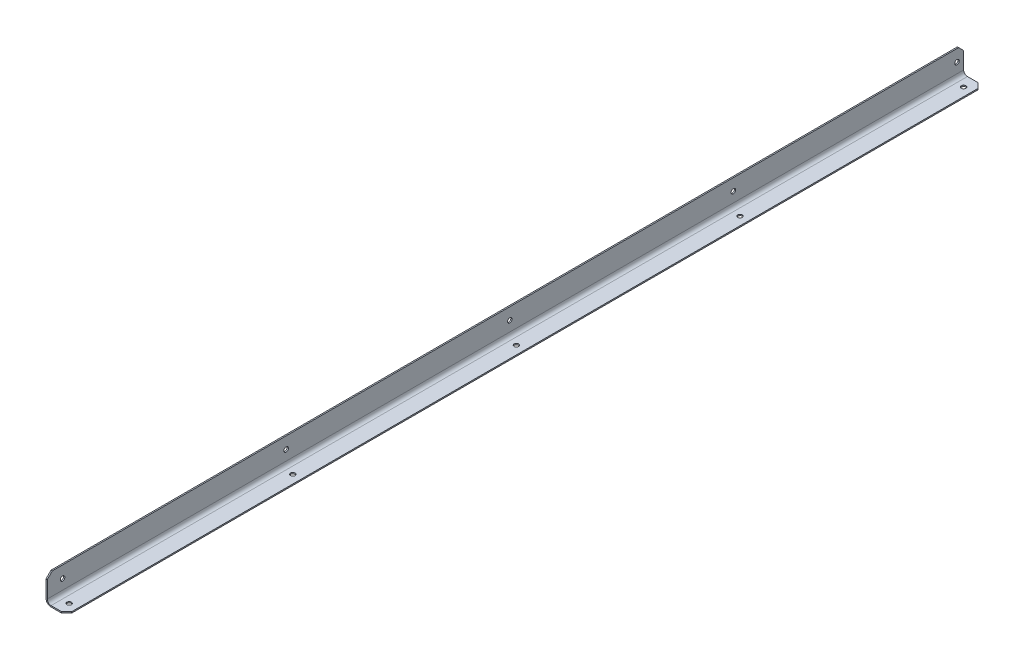
ISO-10303-21;
HEADER;
FILE_DESCRIPTION(('STEP AP214'),'2;1');
FILE_NAME('part.step','',(''),(''),'','','');
FILE_SCHEMA(('AUTOMOTIVE_DESIGN { 1 0 10303 214 1 1 1 1 }'));
ENDSEC;
DATA;
#1=APPLICATION_CONTEXT('core data for automotive mechanical design processes');
#2=APPLICATION_PROTOCOL_DEFINITION('international standard','automotive_design',2000,#1);
#3=PRODUCT_CONTEXT('',#1,'mechanical');
#4=PRODUCT('Part','Part','',(#3));
#5=PRODUCT_RELATED_PRODUCT_CATEGORY('part','',(#4));
#6=PRODUCT_DEFINITION_FORMATION('','',#4);
#7=PRODUCT_DEFINITION_CONTEXT('part definition',#1,'design');
#8=PRODUCT_DEFINITION('design','',#6,#7);
#9=PRODUCT_DEFINITION_SHAPE('','',#8);
#10=(LENGTH_UNIT() NAMED_UNIT(*) SI_UNIT(.MILLI.,.METRE.));
#11=(NAMED_UNIT(*) PLANE_ANGLE_UNIT() SI_UNIT($,.RADIAN.));
#12=(NAMED_UNIT(*) SI_UNIT($,.STERADIAN.) SOLID_ANGLE_UNIT());
#13=UNCERTAINTY_MEASURE_WITH_UNIT(LENGTH_MEASURE(1.E-05),#10,'distance_accuracy_value','');
#14=(GEOMETRIC_REPRESENTATION_CONTEXT(3) GLOBAL_UNCERTAINTY_ASSIGNED_CONTEXT((#13)) GLOBAL_UNIT_ASSIGNED_CONTEXT((#10,
#11,#12)) REPRESENTATION_CONTEXT('',''));
#15=CARTESIAN_POINT('',(0.,0.,0.));
#16=DIRECTION('',(0.,0.,1.));
#17=DIRECTION('',(1.,0.,0.));
#18=AXIS2_PLACEMENT_3D('',#15,#16,#17);
#19=CARTESIAN_POINT('',(10.8407408787145,-6.02685163262695,543.5));
#20=DIRECTION('',(0.707106781186561,0.,0.707106781186534));
#21=DIRECTION('',(0.707106781186534,0.,-0.707106781186561));
#22=AXIS2_PLACEMENT_3D('',#19,#20,#21);
#23=PLANE('',#22);
#24=DIRECTION('',(0.70710678118656,0.,-0.707106781186535));
#25=VECTOR('',#24,1.);
#26=CARTESIAN_POINT('',(7.84074087871446,-10.1851849659603,546.5));
#27=LINE('',#26,#25);
#28=CARTESIAN_POINT('',(7.84074087871445,-10.1851849659603,546.5));
#29=VERTEX_POINT('',#28);
#30=CARTESIAN_POINT('',(13.8407408787145,-10.1851849659603,540.5));
#31=VERTEX_POINT('',#30);
#32=EDGE_CURVE('E179',#29,#31,#27,.T.);
#33=ORIENTED_EDGE('',*,*,#32,.F.);
#34=DIRECTION('',(0.,1.,0.));
#35=VECTOR('',#34,1.);
#36=CARTESIAN_POINT('',(7.8407408787146,-6.02685163262695,546.5));
#37=LINE('',#36,#35);
#38=CARTESIAN_POINT('',(7.84074087871445,-11.6851849659603,546.5));
#39=VERTEX_POINT('',#38);
#40=EDGE_CURVE('E198',#29,#39,#37,.F.);
#41=ORIENTED_EDGE('',*,*,#40,.T.);
#42=DIRECTION('',(-0.707106781186561,0.,0.707106781186535));
#43=VECTOR('',#42,1.);
#44=CARTESIAN_POINT('',(13.8407408787145,-11.6851849659603,540.5));
#45=LINE('',#44,#43);
#46=CARTESIAN_POINT('',(13.8407408787145,-11.6851849659603,540.5));
#47=VERTEX_POINT('',#46);
#48=EDGE_CURVE('E119',#47,#39,#45,.T.);
#49=ORIENTED_EDGE('',*,*,#48,.F.);
#50=DIRECTION('',(0.,1.,0.));
#51=VECTOR('',#50,1.);
#52=CARTESIAN_POINT('',(13.8407408787145,-10.1851849659603,540.5));
#53=LINE('',#52,#51);
#54=EDGE_CURVE('E197',#31,#47,#53,.F.);
#55=ORIENTED_EDGE('',*,*,#54,.F.);
#56=EDGE_LOOP('',(#33,#41,#49,#55));
#57=FACE_BOUND('',#56,.T.);
#58=ADVANCED_FACE('F15',(#57),#23,.T.);
#59=CARTESIAN_POINT('',(10.8407408787145,-6.02685163262695,-543.5));
#60=DIRECTION('',(0.707106781186527,0.,-0.707106781186568));
#61=DIRECTION('',(-0.707106781186568,0.,-0.707106781186527));
#62=AXIS2_PLACEMENT_3D('',#59,#60,#61);
#63=PLANE('',#62);
#64=DIRECTION('',(-0.707106781186554,0.,-0.707106781186541));
#65=VECTOR('',#64,1.);
#66=CARTESIAN_POINT('',(13.8407408787145,-10.1851849659603,-540.5));
#67=LINE('',#66,#65);
#68=CARTESIAN_POINT('',(13.8407408787145,-10.1851849659603,-540.5));
#69=VERTEX_POINT('',#68);
#70=CARTESIAN_POINT('',(7.84074087871447,-10.1851849659603,-546.5));
#71=VERTEX_POINT('',#70);
#72=EDGE_CURVE('E169',#69,#71,#67,.T.);
#73=ORIENTED_EDGE('',*,*,#72,.F.);
#74=DIRECTION('',(0.,1.,0.));
#75=VECTOR('',#74,1.);
#76=CARTESIAN_POINT('',(13.8407408787145,-10.1851849659603,-540.5));
#77=LINE('',#76,#75);
#78=CARTESIAN_POINT('',(13.8407408787145,-11.6851849659603,-540.5));
#79=VERTEX_POINT('',#78);
#80=EDGE_CURVE('E189',#79,#69,#77,.T.);
#81=ORIENTED_EDGE('',*,*,#80,.F.);
#82=DIRECTION('',(0.707106781186554,0.,0.707106781186541));
#83=VECTOR('',#82,1.);
#84=CARTESIAN_POINT('',(7.84074087871446,-11.6851849659603,-546.5));
#85=LINE('',#84,#83);
#86=CARTESIAN_POINT('',(7.84074087871447,-11.6851849659603,-546.5));
#87=VERTEX_POINT('',#86);
#88=EDGE_CURVE('E118',#87,#79,#85,.T.);
#89=ORIENTED_EDGE('',*,*,#88,.F.);
#90=DIRECTION('',(0.,1.,0.));
#91=VECTOR('',#90,1.);
#92=CARTESIAN_POINT('',(7.84074087871438,-6.02685163262695,-546.5));
#93=LINE('',#92,#91);
#94=EDGE_CURVE('E195',#87,#71,#93,.T.);
#95=ORIENTED_EDGE('',*,*,#94,.T.);
#96=EDGE_LOOP('',(#73,#81,#89,#95));
#97=FACE_BOUND('',#96,.T.);
#98=ADVANCED_FACE('F325',(#97),#63,.T.);
#99=CARTESIAN_POINT('',(13.8407408787145,-10.1851849659603,-546.5));
#100=DIRECTION('',(1.,0.,0.));
#101=DIRECTION('',(0.,0.,-1.));
#102=AXIS2_PLACEMENT_3D('',#99,#100,#101);
#103=PLANE('',#102);
#104=ORIENTED_EDGE('',*,*,#80,.T.);
#105=DIRECTION('',(0.,0.,1.));
#106=VECTOR('',#105,1.);
#107=CARTESIAN_POINT('',(13.8407408787145,-10.1851849659603,-546.5));
#108=LINE('',#107,#106);
#109=EDGE_CURVE('E173',#31,#69,#108,.F.);
#110=ORIENTED_EDGE('',*,*,#109,.F.);
#111=ORIENTED_EDGE('',*,*,#54,.T.);
#112=DIRECTION('',(0.,0.,-1.));
#113=VECTOR('',#112,1.);
#114=CARTESIAN_POINT('',(13.8407408787145,-11.6851849659603,-546.5));
#115=LINE('',#114,#113);
#116=EDGE_CURVE('E155',#79,#47,#115,.F.);
#117=ORIENTED_EDGE('',*,*,#116,.F.);
#118=EDGE_LOOP('',(#104,#110,#111,#117));
#119=FACE_BOUND('',#118,.T.);
#120=ADVANCED_FACE('F328',(#119),#103,.T.);
#121=CARTESIAN_POINT('',(3.84074087871446,-11.6851849659603,533.4));
#122=DIRECTION('',(0.,1.,0.));
#123=DIRECTION('',(-1.,0.,0.));
#124=AXIS2_PLACEMENT_3D('',#121,#122,#123);
#125=CYLINDRICAL_SURFACE('',#124,2.7);
#126=CARTESIAN_POINT('',(3.84074087871446,-10.1851849659603,533.4));
#127=DIRECTION('',(0.,1.,0.));
#128=DIRECTION('',(-1.,0.,0.));
#129=AXIS2_PLACEMENT_3D('',#126,#127,#128);
#130=CIRCLE('',#129,2.7);
#131=CARTESIAN_POINT('',(1.14074087871446,-10.1851849659603,533.4));
#132=VERTEX_POINT('',#131);
#133=EDGE_CURVE('E19',#132,#132,#130,.F.);
#134=ORIENTED_EDGE('',*,*,#133,.F.);
#135=EDGE_LOOP('',(#134));
#136=FACE_BOUND('',#135,.T.);
#137=CARTESIAN_POINT('',(3.84074087871446,-11.6851849659603,533.4));
#138=DIRECTION('',(0.,1.,0.));
#139=DIRECTION('',(-1.,0.,0.));
#140=AXIS2_PLACEMENT_3D('',#137,#138,#139);
#141=CIRCLE('',#140,2.7);
#142=CARTESIAN_POINT('',(1.14074087871447,-11.6851849659603,533.4));
#143=VERTEX_POINT('',#142);
#144=EDGE_CURVE('E152',#143,#143,#141,.T.);
#145=ORIENTED_EDGE('',*,*,#144,.F.);
#146=EDGE_LOOP('',(#145));
#147=FACE_BOUND('',#146,.T.);
#148=ADVANCED_FACE('F460',(#136,#147),#125,.F.);
#149=CARTESIAN_POINT('',(3.84074087871446,-11.6851849659603,266.7));
#150=DIRECTION('',(0.,1.,0.));
#151=DIRECTION('',(-1.,0.,0.));
#152=AXIS2_PLACEMENT_3D('',#149,#150,#151);
#153=CYLINDRICAL_SURFACE('',#152,2.69999999999999);
#154=CARTESIAN_POINT('',(3.84074087871446,-10.1851849659603,266.7));
#155=DIRECTION('',(0.,1.,0.));
#156=DIRECTION('',(-1.,0.,0.));
#157=AXIS2_PLACEMENT_3D('',#154,#155,#156);
#158=CIRCLE('',#157,2.69999999999999);
#159=CARTESIAN_POINT('',(1.14074087871447,-10.1851849659603,266.7));
#160=VERTEX_POINT('',#159);
#161=EDGE_CURVE('E164',#160,#160,#158,.F.);
#162=ORIENTED_EDGE('',*,*,#161,.F.);
#163=EDGE_LOOP('',(#162));
#164=FACE_BOUND('',#163,.T.);
#165=CARTESIAN_POINT('',(3.84074087871446,-11.6851849659603,266.7));
#166=DIRECTION('',(0.,1.,0.));
#167=DIRECTION('',(-1.,0.,0.));
#168=AXIS2_PLACEMENT_3D('',#165,#166,#167);
#169=CIRCLE('',#168,2.69999999999999);
#170=CARTESIAN_POINT('',(1.14074087871447,-11.6851849659603,266.7));
#171=VERTEX_POINT('',#170);
#172=EDGE_CURVE('E149',#171,#171,#169,.T.);
#173=ORIENTED_EDGE('',*,*,#172,.F.);
#174=EDGE_LOOP('',(#173));
#175=FACE_BOUND('',#174,.T.);
#176=ADVANCED_FACE('F456',(#164,#175),#153,.F.);
#177=CARTESIAN_POINT('',(3.84074087871446,-11.6851849659603,0.));
#178=DIRECTION('',(0.,1.,0.));
#179=DIRECTION('',(-1.,0.,0.));
#180=AXIS2_PLACEMENT_3D('',#177,#178,#179);
#181=CYLINDRICAL_SURFACE('',#180,2.7);
#182=CARTESIAN_POINT('',(3.84074087871446,-10.1851849659603,0.));
#183=DIRECTION('',(0.,1.,0.));
#184=DIRECTION('',(-1.,0.,0.));
#185=AXIS2_PLACEMENT_3D('',#182,#183,#184);
#186=CIRCLE('',#185,2.7);
#187=CARTESIAN_POINT('',(1.14074087871446,-10.1851849659603,0.));
#188=VERTEX_POINT('',#187);
#189=EDGE_CURVE('E162',#188,#188,#186,.F.);
#190=ORIENTED_EDGE('',*,*,#189,.F.);
#191=EDGE_LOOP('',(#190));
#192=FACE_BOUND('',#191,.T.);
#193=CARTESIAN_POINT('',(3.84074087871446,-11.6851849659603,0.));
#194=DIRECTION('',(0.,1.,0.));
#195=DIRECTION('',(-1.,0.,0.));
#196=AXIS2_PLACEMENT_3D('',#193,#194,#195);
#197=CIRCLE('',#196,2.7);
#198=CARTESIAN_POINT('',(1.14074087871446,-11.6851849659603,0.));
#199=VERTEX_POINT('',#198);
#200=EDGE_CURVE('E146',#199,#199,#197,.T.);
#201=ORIENTED_EDGE('',*,*,#200,.F.);
#202=EDGE_LOOP('',(#201));
#203=FACE_BOUND('',#202,.T.);
#204=ADVANCED_FACE('F452',(#192,#203),#181,.F.);
#205=CARTESIAN_POINT('',(3.84074087871446,-11.6851849659603,-266.7));
#206=DIRECTION('',(0.,1.,0.));
#207=DIRECTION('',(-1.,0.,0.));
#208=AXIS2_PLACEMENT_3D('',#205,#206,#207);
#209=CYLINDRICAL_SURFACE('',#208,2.69999999999999);
#210=CARTESIAN_POINT('',(3.84074087871446,-10.1851849659603,-266.7));
#211=DIRECTION('',(0.,1.,0.));
#212=DIRECTION('',(-1.,0.,0.));
#213=AXIS2_PLACEMENT_3D('',#210,#211,#212);
#214=CIRCLE('',#213,2.69999999999999);
#215=CARTESIAN_POINT('',(1.14074087871447,-10.1851849659603,-266.7));
#216=VERTEX_POINT('',#215);
#217=EDGE_CURVE('E159',#216,#216,#214,.F.);
#218=ORIENTED_EDGE('',*,*,#217,.F.);
#219=EDGE_LOOP('',(#218));
#220=FACE_BOUND('',#219,.T.);
#221=CARTESIAN_POINT('',(3.84074087871446,-11.6851849659603,-266.7));
#222=DIRECTION('',(0.,1.,0.));
#223=DIRECTION('',(-1.,0.,0.));
#224=AXIS2_PLACEMENT_3D('',#221,#222,#223);
#225=CIRCLE('',#224,2.69999999999999);
#226=CARTESIAN_POINT('',(1.14074087871447,-11.6851849659603,-266.7));
#227=VERTEX_POINT('',#226);
#228=EDGE_CURVE('E143',#227,#227,#225,.T.);
#229=ORIENTED_EDGE('',*,*,#228,.F.);
#230=EDGE_LOOP('',(#229));
#231=FACE_BOUND('',#230,.T.);
#232=ADVANCED_FACE('F448',(#220,#231),#209,.F.);
#233=CARTESIAN_POINT('',(3.84074087871446,-11.6851849659603,-533.4));
#234=DIRECTION('',(0.,1.,0.));
#235=DIRECTION('',(-1.,0.,0.));
#236=AXIS2_PLACEMENT_3D('',#233,#234,#235);
#237=CYLINDRICAL_SURFACE('',#236,2.70000000000002);
#238=CARTESIAN_POINT('',(3.84074087871446,-10.1851849659603,-533.4));
#239=DIRECTION('',(0.,1.,0.));
#240=DIRECTION('',(-1.,0.,0.));
#241=AXIS2_PLACEMENT_3D('',#238,#239,#240);
#242=CIRCLE('',#241,2.70000000000002);
#243=CARTESIAN_POINT('',(1.14074087871444,-10.1851849659603,-533.4));
#244=VERTEX_POINT('',#243);
#245=EDGE_CURVE('E156',#244,#244,#242,.F.);
#246=ORIENTED_EDGE('',*,*,#245,.F.);
#247=EDGE_LOOP('',(#246));
#248=FACE_BOUND('',#247,.T.);
#249=CARTESIAN_POINT('',(3.84074087871446,-11.6851849659603,-533.4));
#250=DIRECTION('',(0.,1.,0.));
#251=DIRECTION('',(-1.,0.,0.));
#252=AXIS2_PLACEMENT_3D('',#249,#250,#251);
#253=CIRCLE('',#252,2.70000000000002);
#254=CARTESIAN_POINT('',(1.14074087871444,-11.6851849659603,-533.4));
#255=VERTEX_POINT('',#254);
#256=EDGE_CURVE('E140',#255,#255,#253,.T.);
#257=ORIENTED_EDGE('',*,*,#256,.F.);
#258=EDGE_LOOP('',(#257));
#259=FACE_BOUND('',#258,.T.);
#260=ADVANCED_FACE('F444',(#248,#259),#237,.F.);
#261=CARTESIAN_POINT('',(-9.25925912128555,-10.1851849659603,-546.5));
#262=DIRECTION('',(0.,1.,0.));
#263=DIRECTION('',(0.,0.,1.));
#264=AXIS2_PLACEMENT_3D('',#261,#262,#263);
#265=PLANE('',#264);
#266=ORIENTED_EDGE('',*,*,#245,.T.);
#267=EDGE_LOOP('',(#266));
#268=FACE_BOUND('',#267,.T.);
#269=ORIENTED_EDGE('',*,*,#217,.T.);
#270=EDGE_LOOP('',(#269));
#271=FACE_BOUND('',#270,.T.);
#272=ORIENTED_EDGE('',*,*,#189,.T.);
#273=EDGE_LOOP('',(#272));
#274=FACE_BOUND('',#273,.T.);
#275=ORIENTED_EDGE('',*,*,#161,.T.);
#276=EDGE_LOOP('',(#275));
#277=FACE_BOUND('',#276,.T.);
#278=ORIENTED_EDGE('',*,*,#133,.T.);
#279=EDGE_LOOP('',(#278));
#280=FACE_BOUND('',#279,.T.);
#281=DIRECTION('',(0.,0.,-1.));
#282=VECTOR('',#281,1.);
#283=CARTESIAN_POINT('',(-4.75925912128554,-10.1851849659603,1.421085E-13));
#284=LINE('',#283,#282);
#285=CARTESIAN_POINT('',(-4.75925912128554,-10.1851849659603,-546.5));
#286=VERTEX_POINT('',#285);
#287=CARTESIAN_POINT('',(-4.75925912128554,-10.1851849659603,546.5));
#288=VERTEX_POINT('',#287);
#289=EDGE_CURVE('E183',#286,#288,#284,.F.);
#290=ORIENTED_EDGE('',*,*,#289,.T.);
#291=DIRECTION('',(1.,0.,0.));
#292=VECTOR('',#291,1.);
#293=CARTESIAN_POINT('',(-4.69259245461888,-10.1851849659603,546.5));
#294=LINE('',#293,#292);
#295=EDGE_CURVE('E128',#29,#288,#294,.F.);
#296=ORIENTED_EDGE('',*,*,#295,.F.);
#297=ORIENTED_EDGE('',*,*,#32,.T.);
#298=ORIENTED_EDGE('',*,*,#109,.T.);
#299=ORIENTED_EDGE('',*,*,#72,.T.);
#300=DIRECTION('',(1.,0.,0.));
#301=VECTOR('',#300,1.);
#302=CARTESIAN_POINT('',(-4.69259245461888,-10.1851849659603,-546.5));
#303=LINE('',#302,#301);
#304=EDGE_CURVE('E248',#71,#286,#303,.F.);
#305=ORIENTED_EDGE('',*,*,#304,.T.);
#306=EDGE_LOOP('',(#290,#296,#297,#298,#299,#305));
#307=FACE_BOUND('',#306,.T.);
#308=ADVANCED_FACE('F447',(#268,#271,#274,#277,#280,#307),#265,.T.);
#309=CARTESIAN_POINT('',(-4.75925912128555,-5.68518496596028,1.421085E-13));
#310=DIRECTION('',(0.,0.,-1.));
#311=DIRECTION('',(-1.,0.,0.));
#312=AXIS2_PLACEMENT_3D('',#309,#310,#311);
#313=CYLINDRICAL_SURFACE('',#312,6.);
#314=DIRECTION('',(0.,0.,-1.));
#315=VECTOR('',#314,1.);
#316=CARTESIAN_POINT('',(-4.75925912128554,-11.6851849659603,-546.5));
#317=LINE('',#316,#315);
#318=CARTESIAN_POINT('',(-4.75925912128555,-11.6851849659603,546.5));
#319=VERTEX_POINT('',#318);
#320=CARTESIAN_POINT('',(-4.75925912128555,-11.6851849659603,-546.5));
#321=VERTEX_POINT('',#320);
#322=EDGE_CURVE('E107',#319,#321,#317,.T.);
#323=ORIENTED_EDGE('',*,*,#322,.F.);
#324=CARTESIAN_POINT('',(-4.75925912128555,-5.68518496596028,546.5));
#325=DIRECTION('',(0.,0.,-1.));
#326=DIRECTION('',(-1.,0.,0.));
#327=AXIS2_PLACEMENT_3D('',#324,#325,#326);
#328=CIRCLE('',#327,6.);
#329=CARTESIAN_POINT('',(-10.7592591212855,-5.68518496596028,546.5));
#330=VERTEX_POINT('',#329);
#331=EDGE_CURVE('E111',#330,#319,#328,.F.);
#332=ORIENTED_EDGE('',*,*,#331,.F.);
#333=DIRECTION('',(0.,0.,1.));
#334=VECTOR('',#333,1.);
#335=CARTESIAN_POINT('',(-10.7592591212855,-5.68518496596028,-546.5));
#336=LINE('',#335,#334);
#337=CARTESIAN_POINT('',(-10.7592591212855,-5.68518496596028,-546.5));
#338=VERTEX_POINT('',#337);
#339=EDGE_CURVE('E102',#338,#330,#336,.T.);
#340=ORIENTED_EDGE('',*,*,#339,.F.);
#341=CARTESIAN_POINT('',(-4.75925912128555,-5.68518496596028,-546.5));
#342=DIRECTION('',(0.,0.,-1.));
#343=DIRECTION('',(-1.,0.,0.));
#344=AXIS2_PLACEMENT_3D('',#341,#342,#343);
#345=CIRCLE('',#344,6.);
#346=EDGE_CURVE('E114',#338,#321,#345,.F.);
#347=ORIENTED_EDGE('',*,*,#346,.T.);
#348=EDGE_LOOP('',(#323,#332,#340,#347));
#349=FACE_BOUND('',#348,.T.);
#350=ADVANCED_FACE('F109',(#349),#313,.T.);
#351=CARTESIAN_POINT('',(13.8407408787145,-11.6851849659603,-546.5));
#352=DIRECTION('',(0.,-1.,0.));
#353=DIRECTION('',(0.,0.,-1.));
#354=AXIS2_PLACEMENT_3D('',#351,#352,#353);
#355=PLANE('',#354);
#356=ORIENTED_EDGE('',*,*,#256,.T.);
#357=EDGE_LOOP('',(#356));
#358=FACE_BOUND('',#357,.T.);
#359=ORIENTED_EDGE('',*,*,#228,.T.);
#360=EDGE_LOOP('',(#359));
#361=FACE_BOUND('',#360,.T.);
#362=ORIENTED_EDGE('',*,*,#200,.T.);
#363=EDGE_LOOP('',(#362));
#364=FACE_BOUND('',#363,.T.);
#365=ORIENTED_EDGE('',*,*,#172,.T.);
#366=EDGE_LOOP('',(#365));
#367=FACE_BOUND('',#366,.T.);
#368=ORIENTED_EDGE('',*,*,#144,.T.);
#369=EDGE_LOOP('',(#368));
#370=FACE_BOUND('',#369,.T.);
#371=ORIENTED_EDGE('',*,*,#88,.T.);
#372=ORIENTED_EDGE('',*,*,#116,.T.);
#373=ORIENTED_EDGE('',*,*,#48,.T.);
#374=DIRECTION('',(1.,0.,0.));
#375=VECTOR('',#374,1.);
#376=CARTESIAN_POINT('',(-4.69259245461888,-11.6851849659603,546.5));
#377=LINE('',#376,#375);
#378=EDGE_CURVE('E123',#319,#39,#377,.T.);
#379=ORIENTED_EDGE('',*,*,#378,.F.);
#380=ORIENTED_EDGE('',*,*,#322,.T.);
#381=DIRECTION('',(1.,0.,0.));
#382=VECTOR('',#381,1.);
#383=CARTESIAN_POINT('',(-4.69259245461888,-11.6851849659603,-546.5));
#384=LINE('',#383,#382);
#385=EDGE_CURVE('E245',#321,#87,#384,.T.);
#386=ORIENTED_EDGE('',*,*,#385,.T.);
#387=EDGE_LOOP('',(#371,#372,#373,#379,#380,#386));
#388=FACE_BOUND('',#387,.T.);
#389=ADVANCED_FACE('F125',(#358,#361,#364,#367,#370,#388),#355,.T.);
#390=CARTESIAN_POINT('',(-10.7592591212855,-11.6851849659603,-546.5));
#391=DIRECTION('',(-1.,0.,0.));
#392=DIRECTION('',(0.,0.,1.));
#393=AXIS2_PLACEMENT_3D('',#390,#391,#392);
#394=PLANE('',#393);
#395=CARTESIAN_POINT('',(-10.7592591212855,6.31481503403961,-538.558));
#396=DIRECTION('',(1.,0.,0.));
#397=DIRECTION('',(0.,0.,-1.));
#398=AXIS2_PLACEMENT_3D('',#395,#396,#397);
#399=CIRCLE('',#398,2.70000000000001);
#400=CARTESIAN_POINT('',(-10.7592591212855,6.31481503403961,-541.258));
#401=VERTEX_POINT('',#400);
#402=EDGE_CURVE('E228',#401,#401,#399,.T.);
#403=ORIENTED_EDGE('',*,*,#402,.T.);
#404=EDGE_LOOP('',(#403));
#405=FACE_BOUND('',#404,.T.);
#406=CARTESIAN_POINT('',(-10.7592591212855,6.31481503403977,-271.858));
#407=DIRECTION('',(1.,0.,0.));
#408=DIRECTION('',(0.,0.,-1.));
#409=AXIS2_PLACEMENT_3D('',#406,#407,#408);
#410=CIRCLE('',#409,2.70000000000005);
#411=CARTESIAN_POINT('',(-10.7592591212855,6.31481503403977,-274.558));
#412=VERTEX_POINT('',#411);
#413=EDGE_CURVE('E232',#412,#412,#410,.T.);
#414=ORIENTED_EDGE('',*,*,#413,.T.);
#415=EDGE_LOOP('',(#414));
#416=FACE_BOUND('',#415,.T.);
#417=CARTESIAN_POINT('',(-10.7592591212855,6.31481503403972,-5.15799999999999));
#418=DIRECTION('',(1.,0.,0.));
#419=DIRECTION('',(0.,0.,-1.));
#420=AXIS2_PLACEMENT_3D('',#417,#418,#419);
#421=CIRCLE('',#420,2.7);
#422=CARTESIAN_POINT('',(-10.7592591212855,6.31481503403972,-7.85799999999999));
#423=VERTEX_POINT('',#422);
#424=EDGE_CURVE('E235',#423,#423,#421,.T.);
#425=ORIENTED_EDGE('',*,*,#424,.T.);
#426=EDGE_LOOP('',(#425));
#427=FACE_BOUND('',#426,.T.);
#428=CARTESIAN_POINT('',(-10.7592591212855,6.31481503403966,261.542));
#429=DIRECTION('',(1.,0.,0.));
#430=DIRECTION('',(0.,0.,-1.));
#431=AXIS2_PLACEMENT_3D('',#428,#429,#430);
#432=CIRCLE('',#431,2.69999999999995);
#433=CARTESIAN_POINT('',(-10.7592591212855,6.31481503403966,258.842));
#434=VERTEX_POINT('',#433);
#435=EDGE_CURVE('E238',#434,#434,#432,.T.);
#436=ORIENTED_EDGE('',*,*,#435,.T.);
#437=EDGE_LOOP('',(#436));
#438=FACE_BOUND('',#437,.T.);
#439=CARTESIAN_POINT('',(-10.7592591212855,6.31481503403972,528.242));
#440=DIRECTION('',(1.,0.,0.));
#441=DIRECTION('',(0.,0.,-1.));
#442=AXIS2_PLACEMENT_3D('',#439,#440,#441);
#443=CIRCLE('',#442,2.70000000000002);
#444=CARTESIAN_POINT('',(-10.7592591212855,6.31481503403972,525.542));
#445=VERTEX_POINT('',#444);
#446=EDGE_CURVE('E241',#445,#445,#443,.T.);
#447=ORIENTED_EDGE('',*,*,#446,.T.);
#448=EDGE_LOOP('',(#447));
#449=FACE_BOUND('',#448,.T.);
#450=ORIENTED_EDGE('',*,*,#339,.T.);
#451=DIRECTION('',(0.,1.,0.));
#452=VECTOR('',#451,1.);
#453=CARTESIAN_POINT('',(-10.7592591212855,-1.86851829929362,546.5));
#454=LINE('',#453,#452);
#455=CARTESIAN_POINT('',(-10.7592591212855,14.4148150340398,546.5));
#456=VERTEX_POINT('',#455);
#457=EDGE_CURVE('E132',#456,#330,#454,.F.);
#458=ORIENTED_EDGE('',*,*,#457,.F.);
#459=DIRECTION('',(0.,-0.707106781186534,0.707106781186561));
#460=VECTOR('',#459,1.);
#461=CARTESIAN_POINT('',(-10.7592591212855,17.4148150340397,543.5));
#462=LINE('',#461,#460);
#463=CARTESIAN_POINT('',(-10.7592591212855,20.4148150340397,540.5));
#464=VERTEX_POINT('',#463);
#465=EDGE_CURVE('E294',#464,#456,#462,.T.);
#466=ORIENTED_EDGE('',*,*,#465,.F.);
#467=DIRECTION('',(0.,0.,1.));
#468=VECTOR('',#467,1.);
#469=CARTESIAN_POINT('',(-10.7592591212855,20.4148150340397,-546.5));
#470=LINE('',#469,#468);
#471=CARTESIAN_POINT('',(-10.7592591212855,20.4148150340397,-540.5));
#472=VERTEX_POINT('',#471);
#473=EDGE_CURVE('E244',#472,#464,#470,.T.);
#474=ORIENTED_EDGE('',*,*,#473,.F.);
#475=DIRECTION('',(0.,0.707106781186568,0.707106781186527));
#476=VECTOR('',#475,1.);
#477=CARTESIAN_POINT('',(-10.7592591212855,17.4148150340397,-543.5));
#478=LINE('',#477,#476);
#479=CARTESIAN_POINT('',(-10.7592591212855,14.4148150340397,-546.5));
#480=VERTEX_POINT('',#479);
#481=EDGE_CURVE('E278',#480,#472,#478,.T.);
#482=ORIENTED_EDGE('',*,*,#481,.F.);
#483=DIRECTION('',(0.,1.,0.));
#484=VECTOR('',#483,1.);
#485=CARTESIAN_POINT('',(-10.7592591212855,-1.86851829929362,-546.5));
#486=LINE('',#485,#484);
#487=EDGE_CURVE('E246',#480,#338,#486,.F.);
#488=ORIENTED_EDGE('',*,*,#487,.T.);
#489=EDGE_LOOP('',(#450,#458,#466,#474,#482,#488));
#490=FACE_BOUND('',#489,.T.);
#491=ADVANCED_FACE('F341',(#405,#416,#427,#438,#449,#490),#394,.T.);
#492=CARTESIAN_POINT('',(-7.72592578795221,17.4148150340397,543.5));
#493=DIRECTION('',(0.,0.707106781186561,0.707106781186534));
#494=DIRECTION('',(0.,-0.707106781186534,0.707106781186561));
#495=AXIS2_PLACEMENT_3D('',#492,#493,#494);
#496=PLANE('',#495);
#497=ORIENTED_EDGE('',*,*,#465,.T.);
#498=DIRECTION('',(1.,0.,0.));
#499=VECTOR('',#498,1.);
#500=CARTESIAN_POINT('',(-4.69259245461888,14.4148150340397,546.5));
#501=LINE('',#500,#499);
#502=CARTESIAN_POINT('',(-9.25925912128555,14.4148150340397,546.5));
#503=VERTEX_POINT('',#502);
#504=EDGE_CURVE('E134',#503,#456,#501,.F.);
#505=ORIENTED_EDGE('',*,*,#504,.F.);
#506=DIRECTION('',(0.,-0.70710678118656,0.707106781186535));
#507=VECTOR('',#506,1.);
#508=CARTESIAN_POINT('',(-9.25925912128555,20.4148150340397,540.5));
#509=LINE('',#508,#507);
#510=CARTESIAN_POINT('',(-9.25925912128555,20.4148150340397,540.5));
#511=VERTEX_POINT('',#510);
#512=EDGE_CURVE('E231',#511,#503,#509,.T.);
#513=ORIENTED_EDGE('',*,*,#512,.F.);
#514=DIRECTION('',(1.,0.,0.));
#515=VECTOR('',#514,1.);
#516=CARTESIAN_POINT('',(-10.7592591212855,20.4148150340397,540.5));
#517=LINE('',#516,#515);
#518=EDGE_CURVE('E301',#464,#511,#517,.T.);
#519=ORIENTED_EDGE('',*,*,#518,.F.);
#520=EDGE_LOOP('',(#497,#505,#513,#519));
#521=FACE_BOUND('',#520,.T.);
#522=ADVANCED_FACE('F338',(#521),#496,.T.);
#523=CARTESIAN_POINT('',(-4.69259245461888,-1.86851829929362,546.5));
#524=DIRECTION('',(0.,0.,1.));
#525=DIRECTION('',(1.,0.,0.));
#526=AXIS2_PLACEMENT_3D('',#523,#524,#525);
#527=PLANE('',#526);
#528=CARTESIAN_POINT('',(-4.75925912128555,-5.68518496596028,546.5));
#529=DIRECTION('',(0.,0.,-1.));
#530=DIRECTION('',(-1.,0.,0.));
#531=AXIS2_PLACEMENT_3D('',#528,#529,#530);
#532=CIRCLE('',#531,4.5);
#533=CARTESIAN_POINT('',(-9.25925912128555,-5.68518496596028,546.5));
#534=VERTEX_POINT('',#533);
#535=EDGE_CURVE('E138',#288,#534,#532,.T.);
#536=ORIENTED_EDGE('',*,*,#535,.T.);
#537=DIRECTION('',(0.,1.,0.));
#538=VECTOR('',#537,1.);
#539=CARTESIAN_POINT('',(-9.25925912128555,20.4148150340397,546.5));
#540=LINE('',#539,#538);
#541=EDGE_CURVE('E265',#503,#534,#540,.F.);
#542=ORIENTED_EDGE('',*,*,#541,.F.);
#543=ORIENTED_EDGE('',*,*,#504,.T.);
#544=ORIENTED_EDGE('',*,*,#457,.T.);
#545=ORIENTED_EDGE('',*,*,#331,.T.);
#546=ORIENTED_EDGE('',*,*,#378,.T.);
#547=ORIENTED_EDGE('',*,*,#40,.F.);
#548=ORIENTED_EDGE('',*,*,#295,.T.);
#549=EDGE_LOOP('',(#536,#542,#543,#544,#545,#546,#547,#548));
#550=FACE_BOUND('',#549,.T.);
#551=ADVANCED_FACE('F130',(#550),#527,.T.);
#552=CARTESIAN_POINT('',(-4.75925912128555,-5.68518496596028,1.421085E-13));
#553=DIRECTION('',(0.,0.,-1.));
#554=DIRECTION('',(-1.,0.,0.));
#555=AXIS2_PLACEMENT_3D('',#552,#553,#554);
#556=CYLINDRICAL_SURFACE('',#555,4.5);
#557=ORIENTED_EDGE('',*,*,#535,.F.);
#558=ORIENTED_EDGE('',*,*,#289,.F.);
#559=CARTESIAN_POINT('',(-4.75925912128555,-5.68518496596028,-546.5));
#560=DIRECTION('',(0.,0.,-1.));
#561=DIRECTION('',(-1.,0.,0.));
#562=AXIS2_PLACEMENT_3D('',#559,#560,#561);
#563=CIRCLE('',#562,4.5);
#564=CARTESIAN_POINT('',(-9.25925912128555,-5.68518496596028,-546.5));
#565=VERTEX_POINT('',#564);
#566=EDGE_CURVE('E247',#286,#565,#563,.T.);
#567=ORIENTED_EDGE('',*,*,#566,.T.);
#568=DIRECTION('',(0.,0.,-1.));
#569=VECTOR('',#568,1.);
#570=CARTESIAN_POINT('',(-9.25925912128555,-5.68518496596028,-546.5));
#571=LINE('',#570,#569);
#572=EDGE_CURVE('E261',#534,#565,#571,.T.);
#573=ORIENTED_EDGE('',*,*,#572,.F.);
#574=EDGE_LOOP('',(#557,#558,#567,#573));
#575=FACE_BOUND('',#574,.T.);
#576=ADVANCED_FACE('F334',(#575),#556,.F.);
#577=CARTESIAN_POINT('',(-4.69259245461888,-1.86851829929362,-546.5));
#578=DIRECTION('',(0.,0.,1.));
#579=DIRECTION('',(1.,0.,0.));
#580=AXIS2_PLACEMENT_3D('',#577,#578,#579);
#581=PLANE('',#580);
#582=ORIENTED_EDGE('',*,*,#385,.F.);
#583=ORIENTED_EDGE('',*,*,#346,.F.);
#584=ORIENTED_EDGE('',*,*,#487,.F.);
#585=DIRECTION('',(1.,0.,0.));
#586=VECTOR('',#585,1.);
#587=CARTESIAN_POINT('',(-7.72592578795221,14.4148150340396,-546.5));
#588=LINE('',#587,#586);
#589=CARTESIAN_POINT('',(-9.25925912128555,14.4148150340397,-546.5));
#590=VERTEX_POINT('',#589);
#591=EDGE_CURVE('E275',#590,#480,#588,.F.);
#592=ORIENTED_EDGE('',*,*,#591,.F.);
#593=DIRECTION('',(0.,1.,0.));
#594=VECTOR('',#593,1.);
#595=CARTESIAN_POINT('',(-9.25925912128555,20.4148150340397,-546.5));
#596=LINE('',#595,#594);
#597=EDGE_CURVE('E264',#565,#590,#596,.T.);
#598=ORIENTED_EDGE('',*,*,#597,.F.);
#599=ORIENTED_EDGE('',*,*,#566,.F.);
#600=ORIENTED_EDGE('',*,*,#304,.F.);
#601=ORIENTED_EDGE('',*,*,#94,.F.);
#602=EDGE_LOOP('',(#582,#583,#584,#592,#598,#599,#600,#601));
#603=FACE_BOUND('',#602,.T.);
#604=ADVANCED_FACE('F372',(#603),#581,.F.);
#605=CARTESIAN_POINT('',(-7.72592578795221,17.4148150340397,-543.5));
#606=DIRECTION('',(0.,0.707106781186527,-0.707106781186568));
#607=DIRECTION('',(0.,0.707106781186568,0.707106781186527));
#608=AXIS2_PLACEMENT_3D('',#605,#606,#607);
#609=PLANE('',#608);
#610=ORIENTED_EDGE('',*,*,#481,.T.);
#611=DIRECTION('',(1.,0.,0.));
#612=VECTOR('',#611,1.);
#613=CARTESIAN_POINT('',(-10.7592591212855,20.4148150340397,-540.5));
#614=LINE('',#613,#612);
#615=CARTESIAN_POINT('',(-9.25925912128555,20.4148150340397,-540.5));
#616=VERTEX_POINT('',#615);
#617=EDGE_CURVE('E34',#616,#472,#614,.F.);
#618=ORIENTED_EDGE('',*,*,#617,.F.);
#619=DIRECTION('',(0.,0.707106781186554,0.707106781186541));
#620=VECTOR('',#619,1.);
#621=CARTESIAN_POINT('',(-9.25925912128555,14.4148150340397,-546.5));
#622=LINE('',#621,#620);
#623=EDGE_CURVE('E268',#590,#616,#622,.T.);
#624=ORIENTED_EDGE('',*,*,#623,.F.);
#625=ORIENTED_EDGE('',*,*,#591,.T.);
#626=EDGE_LOOP('',(#610,#618,#624,#625));
#627=FACE_BOUND('',#626,.T.);
#628=ADVANCED_FACE('F368',(#627),#609,.T.);
#629=CARTESIAN_POINT('',(-10.7592591212855,20.4148150340397,-546.5));
#630=DIRECTION('',(0.,1.,0.));
#631=DIRECTION('',(0.,0.,1.));
#632=AXIS2_PLACEMENT_3D('',#629,#630,#631);
#633=PLANE('',#632);
#634=ORIENTED_EDGE('',*,*,#617,.T.);
#635=ORIENTED_EDGE('',*,*,#473,.T.);
#636=ORIENTED_EDGE('',*,*,#518,.T.);
#637=DIRECTION('',(0.,0.,-1.));
#638=VECTOR('',#637,1.);
#639=CARTESIAN_POINT('',(-9.25925912128555,20.4148150340397,-546.5));
#640=LINE('',#639,#638);
#641=EDGE_CURVE('E227',#616,#511,#640,.F.);
#642=ORIENTED_EDGE('',*,*,#641,.F.);
#643=EDGE_LOOP('',(#634,#635,#636,#642));
#644=FACE_BOUND('',#643,.T.);
#645=ADVANCED_FACE('F364',(#644),#633,.T.);
#646=CARTESIAN_POINT('',(-10.7592591212855,6.31481503403972,528.242));
#647=DIRECTION('',(1.,0.,0.));
#648=DIRECTION('',(0.,0.,-1.));
#649=AXIS2_PLACEMENT_3D('',#646,#647,#648);
#650=CYLINDRICAL_SURFACE('',#649,2.70000000000002);
#651=CARTESIAN_POINT('',(-9.25925912128555,6.31481503403972,528.242));
#652=DIRECTION('',(1.,0.,0.));
#653=DIRECTION('',(0.,0.,-1.));
#654=AXIS2_PLACEMENT_3D('',#651,#652,#653);
#655=CIRCLE('',#654,2.70000000000002);
#656=CARTESIAN_POINT('',(-9.25925912128555,6.31481503403972,525.542));
#657=VERTEX_POINT('',#656);
#658=EDGE_CURVE('E224',#657,#657,#655,.F.);
#659=ORIENTED_EDGE('',*,*,#658,.F.);
#660=EDGE_LOOP('',(#659));
#661=FACE_BOUND('',#660,.T.);
#662=ORIENTED_EDGE('',*,*,#446,.F.);
#663=EDGE_LOOP('',(#662));
#664=FACE_BOUND('',#663,.T.);
#665=ADVANCED_FACE('F367',(#661,#664),#650,.F.);
#666=CARTESIAN_POINT('',(-10.7592591212855,6.31481503403966,261.542));
#667=DIRECTION('',(1.,0.,0.));
#668=DIRECTION('',(0.,0.,-1.));
#669=AXIS2_PLACEMENT_3D('',#666,#667,#668);
#670=CYLINDRICAL_SURFACE('',#669,2.69999999999995);
#671=CARTESIAN_POINT('',(-9.25925912128555,6.31481503403966,261.542));
#672=DIRECTION('',(1.,0.,0.));
#673=DIRECTION('',(0.,0.,-1.));
#674=AXIS2_PLACEMENT_3D('',#671,#672,#673);
#675=CIRCLE('',#674,2.69999999999995);
#676=CARTESIAN_POINT('',(-9.25925912128555,6.31481503403966,258.842));
#677=VERTEX_POINT('',#676);
#678=EDGE_CURVE('E221',#677,#677,#675,.F.);
#679=ORIENTED_EDGE('',*,*,#678,.F.);
#680=EDGE_LOOP('',(#679));
#681=FACE_BOUND('',#680,.T.);
#682=ORIENTED_EDGE('',*,*,#435,.F.);
#683=EDGE_LOOP('',(#682));
#684=FACE_BOUND('',#683,.T.);
#685=ADVANCED_FACE('F408',(#681,#684),#670,.F.);
#686=CARTESIAN_POINT('',(-10.7592591212855,6.31481503403972,-5.15799999999999));
#687=DIRECTION('',(1.,0.,0.));
#688=DIRECTION('',(0.,0.,-1.));
#689=AXIS2_PLACEMENT_3D('',#686,#687,#688);
#690=CYLINDRICAL_SURFACE('',#689,2.7);
#691=CARTESIAN_POINT('',(-9.25925912128555,6.31481503403972,-5.15799999999999));
#692=DIRECTION('',(1.,0.,0.));
#693=DIRECTION('',(0.,0.,-1.));
#694=AXIS2_PLACEMENT_3D('',#691,#692,#693);
#695=CIRCLE('',#694,2.7);
#696=CARTESIAN_POINT('',(-9.25925912128555,6.31481503403972,-7.85799999999999));
#697=VERTEX_POINT('',#696);
#698=EDGE_CURVE('E218',#697,#697,#695,.F.);
#699=ORIENTED_EDGE('',*,*,#698,.F.);
#700=EDGE_LOOP('',(#699));
#701=FACE_BOUND('',#700,.T.);
#702=ORIENTED_EDGE('',*,*,#424,.F.);
#703=EDGE_LOOP('',(#702));
#704=FACE_BOUND('',#703,.T.);
#705=ADVANCED_FACE('F416',(#701,#704),#690,.F.);
#706=CARTESIAN_POINT('',(-10.7592591212855,6.31481503403977,-271.858));
#707=DIRECTION('',(1.,0.,0.));
#708=DIRECTION('',(0.,0.,-1.));
#709=AXIS2_PLACEMENT_3D('',#706,#707,#708);
#710=CYLINDRICAL_SURFACE('',#709,2.70000000000005);
#711=CARTESIAN_POINT('',(-9.25925912128555,6.31481503403977,-271.858));
#712=DIRECTION('',(1.,0.,0.));
#713=DIRECTION('',(0.,0.,-1.));
#714=AXIS2_PLACEMENT_3D('',#711,#712,#713);
#715=CIRCLE('',#714,2.70000000000005);
#716=CARTESIAN_POINT('',(-9.25925912128555,6.31481503403977,-274.558));
#717=VERTEX_POINT('',#716);
#718=EDGE_CURVE('E25',#717,#717,#715,.F.);
#719=ORIENTED_EDGE('',*,*,#718,.F.);
#720=EDGE_LOOP('',(#719));
#721=FACE_BOUND('',#720,.T.);
#722=ORIENTED_EDGE('',*,*,#413,.F.);
#723=EDGE_LOOP('',(#722));
#724=FACE_BOUND('',#723,.T.);
#725=ADVANCED_FACE('F360',(#721,#724),#710,.F.);
#726=CARTESIAN_POINT('',(-10.7592591212855,6.31481503403961,-538.558));
#727=DIRECTION('',(1.,0.,0.));
#728=DIRECTION('',(0.,0.,-1.));
#729=AXIS2_PLACEMENT_3D('',#726,#727,#728);
#730=CYLINDRICAL_SURFACE('',#729,2.70000000000001);
#731=CARTESIAN_POINT('',(-9.25925912128555,6.31481503403961,-538.558));
#732=DIRECTION('',(1.,0.,0.));
#733=DIRECTION('',(0.,0.,-1.));
#734=AXIS2_PLACEMENT_3D('',#731,#732,#733);
#735=CIRCLE('',#734,2.70000000000001);
#736=CARTESIAN_POINT('',(-9.25925912128555,6.31481503403961,-541.258));
#737=VERTEX_POINT('',#736);
#738=EDGE_CURVE('E9',#737,#737,#735,.F.);
#739=ORIENTED_EDGE('',*,*,#738,.F.);
#740=EDGE_LOOP('',(#739));
#741=FACE_BOUND('',#740,.T.);
#742=ORIENTED_EDGE('',*,*,#402,.F.);
#743=EDGE_LOOP('',(#742));
#744=FACE_BOUND('',#743,.T.);
#745=ADVANCED_FACE('F17',(#741,#744),#730,.F.);
#746=CARTESIAN_POINT('',(-9.25925912128555,20.4148150340397,-546.5));
#747=DIRECTION('',(1.,0.,0.));
#748=DIRECTION('',(0.,0.,-1.));
#749=AXIS2_PLACEMENT_3D('',#746,#747,#748);
#750=PLANE('',#749);
#751=ORIENTED_EDGE('',*,*,#738,.T.);
#752=EDGE_LOOP('',(#751));
#753=FACE_BOUND('',#752,.T.);
#754=ORIENTED_EDGE('',*,*,#718,.T.);
#755=EDGE_LOOP('',(#754));
#756=FACE_BOUND('',#755,.T.);
#757=ORIENTED_EDGE('',*,*,#698,.T.);
#758=EDGE_LOOP('',(#757));
#759=FACE_BOUND('',#758,.T.);
#760=ORIENTED_EDGE('',*,*,#678,.T.);
#761=EDGE_LOOP('',(#760));
#762=FACE_BOUND('',#761,.T.);
#763=ORIENTED_EDGE('',*,*,#658,.T.);
#764=EDGE_LOOP('',(#763));
#765=FACE_BOUND('',#764,.T.);
#766=ORIENTED_EDGE('',*,*,#623,.T.);
#767=ORIENTED_EDGE('',*,*,#641,.T.);
#768=ORIENTED_EDGE('',*,*,#512,.T.);
#769=ORIENTED_EDGE('',*,*,#541,.T.);
#770=ORIENTED_EDGE('',*,*,#572,.T.);
#771=ORIENTED_EDGE('',*,*,#597,.T.);
#772=EDGE_LOOP('',(#766,#767,#768,#769,#770,#771));
#773=FACE_BOUND('',#772,.T.);
#774=ADVANCED_FACE('F336',(#753,#756,#759,#762,#765,#773),#750,.T.);
#775=CLOSED_SHELL('',(#58,#98,#120,#148,#176,#204,#232,#260,#308,#350,#389,#491,#522,#551,#576,
#604,#628,#645,#665,#685,#705,#725,#745,#774));
#776=MANIFOLD_SOLID_BREP('B1',#775);
#777=ADVANCED_BREP_SHAPE_REPRESENTATION('',(#18,#776),#14);
#778=SHAPE_DEFINITION_REPRESENTATION(#9,#777);
ENDSEC;
END-ISO-10303-21;
